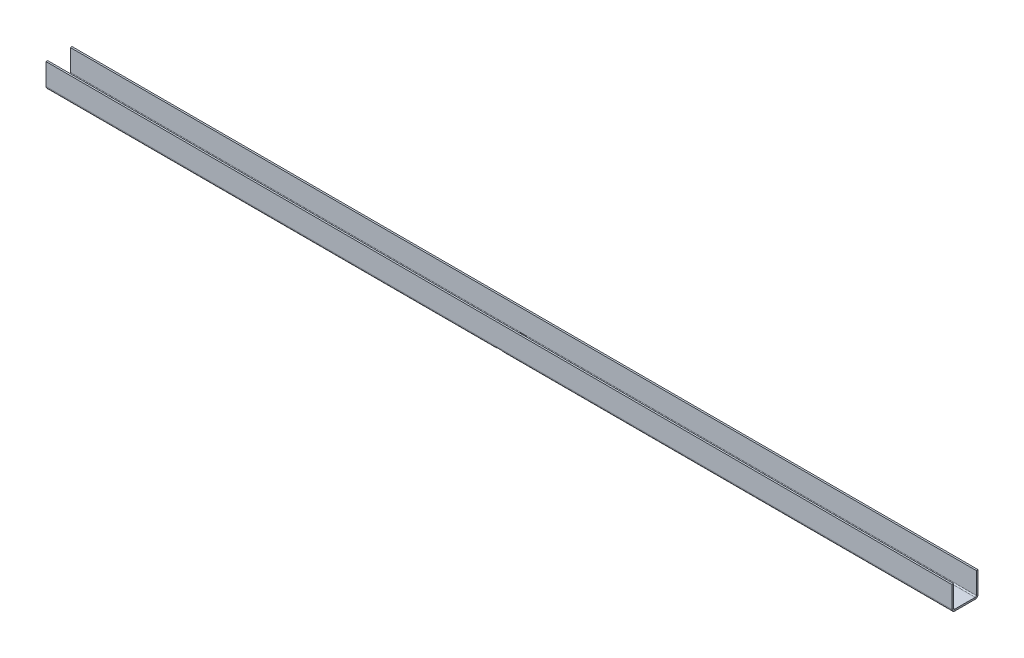
ISO-10303-21;
HEADER;
FILE_DESCRIPTION(('STEP AP214'),'2;1');
FILE_NAME('part.step','',(''),(''),'','','');
FILE_SCHEMA(('AUTOMOTIVE_DESIGN { 1 0 10303 214 1 1 1 1 }'));
ENDSEC;
DATA;
#1=APPLICATION_CONTEXT('core data for automotive mechanical design processes');
#2=APPLICATION_PROTOCOL_DEFINITION('international standard','automotive_design',2000,#1);
#3=PRODUCT_CONTEXT('',#1,'mechanical');
#4=PRODUCT('Part','Part','',(#3));
#5=PRODUCT_RELATED_PRODUCT_CATEGORY('part','',(#4));
#6=PRODUCT_DEFINITION_FORMATION('','',#4);
#7=PRODUCT_DEFINITION_CONTEXT('part definition',#1,'design');
#8=PRODUCT_DEFINITION('design','',#6,#7);
#9=PRODUCT_DEFINITION_SHAPE('','',#8);
#10=(LENGTH_UNIT() NAMED_UNIT(*) SI_UNIT(.MILLI.,.METRE.));
#11=(NAMED_UNIT(*) PLANE_ANGLE_UNIT() SI_UNIT($,.RADIAN.));
#12=(NAMED_UNIT(*) SI_UNIT($,.STERADIAN.) SOLID_ANGLE_UNIT());
#13=UNCERTAINTY_MEASURE_WITH_UNIT(LENGTH_MEASURE(1.E-05),#10,'distance_accuracy_value','');
#14=(GEOMETRIC_REPRESENTATION_CONTEXT(3) GLOBAL_UNCERTAINTY_ASSIGNED_CONTEXT((#13)) GLOBAL_UNIT_ASSIGNED_CONTEXT((#10,
#11,#12)) REPRESENTATION_CONTEXT('',''));
#15=CARTESIAN_POINT('',(0.,0.,0.));
#16=DIRECTION('',(0.,0.,1.));
#17=DIRECTION('',(1.,0.,0.));
#18=AXIS2_PLACEMENT_3D('',#15,#16,#17);
#19=CARTESIAN_POINT('',(400.000000000001,-1.5000000000005,-528.951186384639));
#20=DIRECTION('',(0.,1.,0.));
#21=DIRECTION('',(1.,0.,0.));
#22=AXIS2_PLACEMENT_3D('',#19,#20,#21);
#23=PLANE('',#22);
#24=DIRECTION('',(-1.,0.,0.));
#25=VECTOR('',#24,1.);
#26=CARTESIAN_POINT('',(400.,-1.5000000000005,1071.5));
#27=LINE('',#26,#25);
#28=CARTESIAN_POINT('',(-400.,-1.50000000000028,1071.5));
#29=VERTEX_POINT('',#28);
#30=CARTESIAN_POINT('',(400.,-1.5000000000005,1071.5));
#31=VERTEX_POINT('',#30);
#32=EDGE_CURVE('E302',#29,#31,#27,.F.);
#33=ORIENTED_EDGE('',*,*,#32,.T.);
#34=DIRECTION('',(0.,0.,1.));
#35=VECTOR('',#34,1.);
#36=CARTESIAN_POINT('',(400.000000000001,-1.5000000000005,-528.951186384639));
#37=LINE('',#36,#35);
#38=CARTESIAN_POINT('',(400.,-1.5000000000005,1070.));
#39=VERTEX_POINT('',#38);
#40=EDGE_CURVE('E316',#39,#31,#37,.T.);
#41=ORIENTED_EDGE('',*,*,#40,.F.);
#42=DIRECTION('',(1.,0.,0.));
#43=VECTOR('',#42,1.);
#44=CARTESIAN_POINT('',(400.,-1.5000000000005,1070.));
#45=LINE('',#44,#43);
#46=CARTESIAN_POINT('',(-400.,-1.50000000000028,1070.));
#47=VERTEX_POINT('',#46);
#48=EDGE_CURVE('E94',#39,#47,#45,.F.);
#49=ORIENTED_EDGE('',*,*,#48,.T.);
#50=DIRECTION('',(0.,0.,1.));
#51=VECTOR('',#50,1.);
#52=CARTESIAN_POINT('',(-399.999999999999,-1.50000000000028,-528.95118638464));
#53=LINE('',#52,#51);
#54=EDGE_CURVE('E307',#47,#29,#53,.T.);
#55=ORIENTED_EDGE('',*,*,#54,.T.);
#56=EDGE_LOOP('',(#33,#41,#49,#55));
#57=FACE_BOUND('',#56,.T.);
#58=ADVANCED_FACE('F69',(#57),#23,.T.);
#59=CARTESIAN_POINT('',(-399.999999999999,-23.0000000000004,-528.95118638464));
#60=DIRECTION('',(-1.,0.,0.));
#61=DIRECTION('',(0.,1.,0.));
#62=AXIS2_PLACEMENT_3D('',#59,#60,#61);
#63=PLANE('',#62);
#64=DIRECTION('',(0.,1.,0.));
#65=VECTOR('',#64,1.);
#66=CARTESIAN_POINT('',(-400.,-1.50000000000028,1071.5));
#67=LINE('',#66,#65);
#68=CARTESIAN_POINT('',(-400.,-20.5000000000002,1071.5));
#69=VERTEX_POINT('',#68);
#70=EDGE_CURVE('E294',#69,#29,#67,.T.);
#71=ORIENTED_EDGE('',*,*,#70,.T.);
#72=ORIENTED_EDGE('',*,*,#54,.F.);
#73=DIRECTION('',(0.,1.,0.));
#74=VECTOR('',#73,1.);
#75=CARTESIAN_POINT('',(-400.,-23.0000000000001,1070.));
#76=LINE('',#75,#74);
#77=CARTESIAN_POINT('',(-400.,-20.5000000000002,1070.));
#78=VERTEX_POINT('',#77);
#79=EDGE_CURVE('E306',#47,#78,#76,.F.);
#80=ORIENTED_EDGE('',*,*,#79,.T.);
#81=DIRECTION('',(0.,0.,1.));
#82=VECTOR('',#81,1.);
#83=CARTESIAN_POINT('',(-399.999999999999,-20.5000000000004,-528.95118638464));
#84=LINE('',#83,#82);
#85=EDGE_CURVE('E310',#78,#69,#84,.T.);
#86=ORIENTED_EDGE('',*,*,#85,.T.);
#87=EDGE_LOOP('',(#71,#72,#80,#86));
#88=FACE_BOUND('',#87,.T.);
#89=ADVANCED_FACE('F311',(#88),#63,.T.);
#90=CARTESIAN_POINT('',(400.,-1.5000000000005,1071.5));
#91=DIRECTION('',(0.,0.,-1.));
#92=DIRECTION('',(-1.,0.,0.));
#93=AXIS2_PLACEMENT_3D('',#90,#91,#92);
#94=PLANE('',#93);
#95=DIRECTION('',(-1.,0.,0.));
#96=VECTOR('',#95,1.);
#97=CARTESIAN_POINT('',(400.,-20.5000000000006,1071.5));
#98=LINE('',#97,#96);
#99=CARTESIAN_POINT('',(400.,-20.5000000000002,1071.5));
#100=VERTEX_POINT('',#99);
#101=EDGE_CURVE('E300',#100,#69,#98,.T.);
#102=ORIENTED_EDGE('',*,*,#101,.F.);
#103=DIRECTION('',(0.,1.,0.));
#104=VECTOR('',#103,1.);
#105=CARTESIAN_POINT('',(400.,-1.5000000000005,1071.5));
#106=LINE('',#105,#104);
#107=EDGE_CURVE('E689',#31,#100,#106,.F.);
#108=ORIENTED_EDGE('',*,*,#107,.F.);
#109=ORIENTED_EDGE('',*,*,#32,.F.);
#110=ORIENTED_EDGE('',*,*,#70,.F.);
#111=EDGE_LOOP('',(#102,#108,#109,#110));
#112=FACE_BOUND('',#111,.T.);
#113=ADVANCED_FACE('F297',(#112),#94,.F.);
#114=CARTESIAN_POINT('',(400.000000000001,-20.5000000000004,-528.951186384639));
#115=DIRECTION('',(-1.,0.,0.));
#116=DIRECTION('',(0.,1.,0.));
#117=AXIS2_PLACEMENT_3D('',#114,#115,#116);
#118=PLANE('',#117);
#119=ORIENTED_EDGE('',*,*,#40,.T.);
#120=ORIENTED_EDGE('',*,*,#107,.T.);
#121=DIRECTION('',(0.,0.,1.));
#122=VECTOR('',#121,1.);
#123=CARTESIAN_POINT('',(400.000000000001,-20.5000000000004,-528.951186384639));
#124=LINE('',#123,#122);
#125=CARTESIAN_POINT('',(400.,-20.5000000000002,1070.));
#126=VERTEX_POINT('',#125);
#127=EDGE_CURVE('E74',#126,#100,#124,.T.);
#128=ORIENTED_EDGE('',*,*,#127,.F.);
#129=DIRECTION('',(0.,1.,0.));
#130=VECTOR('',#129,1.);
#131=CARTESIAN_POINT('',(400.,-20.5000000000006,1070.));
#132=LINE('',#131,#130);
#133=EDGE_CURVE('E81',#39,#126,#132,.F.);
#134=ORIENTED_EDGE('',*,*,#133,.F.);
#135=EDGE_LOOP('',(#119,#120,#128,#134));
#136=FACE_BOUND('',#135,.T.);
#137=ADVANCED_FACE('F699',(#136),#118,.F.);
#138=CARTESIAN_POINT('',(400.,-1.5000000000005,1070.));
#139=DIRECTION('',(0.,0.,-1.));
#140=DIRECTION('',(-1.,0.,0.));
#141=AXIS2_PLACEMENT_3D('',#138,#139,#140);
#142=PLANE('',#141);
#143=ORIENTED_EDGE('',*,*,#133,.T.);
#144=DIRECTION('',(-1.,0.,0.));
#145=VECTOR('',#144,1.);
#146=CARTESIAN_POINT('',(400.,-20.5000000000006,1070.));
#147=LINE('',#146,#145);
#148=EDGE_CURVE('E13',#126,#78,#147,.T.);
#149=ORIENTED_EDGE('',*,*,#148,.T.);
#150=ORIENTED_EDGE('',*,*,#79,.F.);
#151=ORIENTED_EDGE('',*,*,#48,.F.);
#152=EDGE_LOOP('',(#143,#149,#150,#151));
#153=FACE_BOUND('',#152,.T.);
#154=ADVANCED_FACE('F72',(#153),#142,.T.);
#155=CARTESIAN_POINT('',(400.,-21.4999999999999,1070.));
#156=DIRECTION('',(0.,1.,0.));
#157=DIRECTION('',(0.,0.,1.));
#158=AXIS2_PLACEMENT_3D('',#155,#156,#157);
#159=PLANE('',#158);
#160=DIRECTION('',(-1.,0.,0.));
#161=VECTOR('',#160,1.);
#162=CARTESIAN_POINT('',(400.,-21.4999999999999,1051.));
#163=LINE('',#162,#161);
#164=CARTESIAN_POINT('',(400.,-21.4999999999999,1051.));
#165=VERTEX_POINT('',#164);
#166=CARTESIAN_POINT('',(2.69999999999998,-21.4999999999999,1051.));
#167=VERTEX_POINT('',#166);
#168=EDGE_CURVE('E472',#165,#167,#163,.T.);
#169=ORIENTED_EDGE('',*,*,#168,.T.);
#170=DIRECTION('',(0.,0.,1.));
#171=VECTOR('',#170,1.);
#172=CARTESIAN_POINT('',(2.69999999999998,-21.4999999999999,1070.));
#173=LINE('',#172,#171);
#174=CARTESIAN_POINT('',(2.7,-21.4999999999999,1053.5));
#175=VERTEX_POINT('',#174);
#176=EDGE_CURVE('E469',#167,#175,#173,.T.);
#177=ORIENTED_EDGE('',*,*,#176,.T.);
#178=DIRECTION('',(-1.,0.,0.));
#179=VECTOR('',#178,1.);
#180=CARTESIAN_POINT('',(400.,-21.4999999999999,1053.5));
#181=LINE('',#180,#179);
#182=CARTESIAN_POINT('',(-2.7,-21.4999999999999,1053.5));
#183=VERTEX_POINT('',#182);
#184=EDGE_CURVE('E465',#175,#183,#181,.T.);
#185=ORIENTED_EDGE('',*,*,#184,.T.);
#186=DIRECTION('',(0.,0.,-1.));
#187=VECTOR('',#186,1.);
#188=CARTESIAN_POINT('',(-2.69999999999998,-21.4999999999999,1070.));
#189=LINE('',#188,#187);
#190=CARTESIAN_POINT('',(-2.69999999999998,-21.4999999999999,1051.));
#191=VERTEX_POINT('',#190);
#192=EDGE_CURVE('E461',#183,#191,#189,.T.);
#193=ORIENTED_EDGE('',*,*,#192,.T.);
#194=CARTESIAN_POINT('',(-400.,-21.4999999999999,1051.));
#195=VERTEX_POINT('',#194);
#196=EDGE_CURVE('E464',#191,#195,#163,.T.);
#197=ORIENTED_EDGE('',*,*,#196,.T.);
#198=DIRECTION('',(0.,0.,1.));
#199=VECTOR('',#198,1.);
#200=CARTESIAN_POINT('',(-400.,-21.4999999999999,1048.5));
#201=LINE('',#200,#199);
#202=CARTESIAN_POINT('',(-400.,-21.5000000000002,1069.));
#203=VERTEX_POINT('',#202);
#204=EDGE_CURVE('E447',#203,#195,#201,.F.);
#205=ORIENTED_EDGE('',*,*,#204,.F.);
#206=DIRECTION('',(1.,0.,0.));
#207=VECTOR('',#206,1.);
#208=CARTESIAN_POINT('',(400.,-21.4999999999999,1069.));
#209=LINE('',#208,#207);
#210=CARTESIAN_POINT('',(-2.70000000000004,-21.4999999999999,1069.));
#211=VERTEX_POINT('',#210);
#212=EDGE_CURVE('E440',#203,#211,#209,.T.);
#213=ORIENTED_EDGE('',*,*,#212,.T.);
#214=DIRECTION('',(0.,0.,-1.));
#215=VECTOR('',#214,1.);
#216=CARTESIAN_POINT('',(-2.70000000000004,-21.4999999999999,1070.));
#217=LINE('',#216,#215);
#218=CARTESIAN_POINT('',(-2.70000000000001,-21.4999999999999,1066.5));
#219=VERTEX_POINT('',#218);
#220=EDGE_CURVE('E446',#211,#219,#217,.T.);
#221=ORIENTED_EDGE('',*,*,#220,.T.);
#222=DIRECTION('',(1.,0.,0.));
#223=VECTOR('',#222,1.);
#224=CARTESIAN_POINT('',(400.,-21.4999999999999,1066.5));
#225=LINE('',#224,#223);
#226=CARTESIAN_POINT('',(2.69999999999999,-21.4999999999999,1066.5));
#227=VERTEX_POINT('',#226);
#228=EDGE_CURVE('E454',#219,#227,#225,.T.);
#229=ORIENTED_EDGE('',*,*,#228,.T.);
#230=DIRECTION('',(0.,0.,1.));
#231=VECTOR('',#230,1.);
#232=CARTESIAN_POINT('',(2.69999999999998,-21.4999999999999,1070.));
#233=LINE('',#232,#231);
#234=CARTESIAN_POINT('',(2.69999999999992,-21.5000000000002,1069.));
#235=VERTEX_POINT('',#234);
#236=EDGE_CURVE('E1221',#227,#235,#233,.T.);
#237=ORIENTED_EDGE('',*,*,#236,.T.);
#238=CARTESIAN_POINT('',(400.,-21.5000000000002,1069.));
#239=VERTEX_POINT('',#238);
#240=EDGE_CURVE('E448',#235,#239,#209,.T.);
#241=ORIENTED_EDGE('',*,*,#240,.T.);
#242=DIRECTION('',(0.,0.,-1.));
#243=VECTOR('',#242,1.);
#244=CARTESIAN_POINT('',(400.,-21.4999999999999,1071.5));
#245=LINE('',#244,#243);
#246=EDGE_CURVE('E1220',#165,#239,#245,.F.);
#247=ORIENTED_EDGE('',*,*,#246,.F.);
#248=EDGE_LOOP('',(#169,#177,#185,#193,#197,#205,#213,#221,#229,#237,#241,#247));
#249=FACE_BOUND('',#248,.T.);
#250=ADVANCED_FACE('F718',(#249),#159,.T.);
#251=CARTESIAN_POINT('',(2.69999999999998,1577.40494875516,1070.));
#252=DIRECTION('',(1.,0.,0.));
#253=DIRECTION('',(0.,-1.,0.));
#254=AXIS2_PLACEMENT_3D('',#251,#252,#253);
#255=PLANE('',#254);
#256=DIRECTION('',(0.,-1.,0.));
#257=VECTOR('',#256,1.);
#258=CARTESIAN_POINT('',(2.69999999999998,1577.40494875516,1051.));
#259=LINE('',#258,#257);
#260=CARTESIAN_POINT('',(2.69999999999992,-22.9999999999999,1051.));
#261=VERTEX_POINT('',#260);
#262=EDGE_CURVE('E683',#167,#261,#259,.T.);
#263=ORIENTED_EDGE('',*,*,#262,.T.);
#264=DIRECTION('',(0.,0.,1.));
#265=VECTOR('',#264,1.);
#266=CARTESIAN_POINT('',(2.69999999999998,-22.9999999999999,1070.));
#267=LINE('',#266,#265);
#268=CARTESIAN_POINT('',(2.7,-22.9999999999999,1053.5));
#269=VERTEX_POINT('',#268);
#270=EDGE_CURVE('E128',#261,#269,#267,.T.);
#271=ORIENTED_EDGE('',*,*,#270,.T.);
#272=DIRECTION('',(0.,-1.,0.));
#273=VECTOR('',#272,1.);
#274=CARTESIAN_POINT('',(2.7,1577.40494875516,1053.5));
#275=LINE('',#274,#273);
#276=EDGE_CURVE('E680',#175,#269,#275,.T.);
#277=ORIENTED_EDGE('',*,*,#276,.F.);
#278=ORIENTED_EDGE('',*,*,#176,.F.);
#279=EDGE_LOOP('',(#263,#271,#277,#278));
#280=FACE_BOUND('',#279,.T.);
#281=ADVANCED_FACE('F708',(#280),#255,.F.);
#282=CARTESIAN_POINT('',(400.,1577.40494875516,1053.5));
#283=DIRECTION('',(0.,0.,1.));
#284=DIRECTION('',(0.,-1.,0.));
#285=AXIS2_PLACEMENT_3D('',#282,#283,#284);
#286=PLANE('',#285);
#287=ORIENTED_EDGE('',*,*,#276,.T.);
#288=DIRECTION('',(-1.,0.,0.));
#289=VECTOR('',#288,1.);
#290=CARTESIAN_POINT('',(400.,-22.9999999999999,1053.5));
#291=LINE('',#290,#289);
#292=CARTESIAN_POINT('',(-2.7,-22.9999999999999,1053.5));
#293=VERTEX_POINT('',#292);
#294=EDGE_CURVE('E136',#269,#293,#291,.T.);
#295=ORIENTED_EDGE('',*,*,#294,.T.);
#296=DIRECTION('',(0.,-1.,0.));
#297=VECTOR('',#296,1.);
#298=CARTESIAN_POINT('',(-2.7,1577.40494875516,1053.5));
#299=LINE('',#298,#297);
#300=EDGE_CURVE('E677',#183,#293,#299,.T.);
#301=ORIENTED_EDGE('',*,*,#300,.F.);
#302=ORIENTED_EDGE('',*,*,#184,.F.);
#303=EDGE_LOOP('',(#287,#295,#301,#302));
#304=FACE_BOUND('',#303,.T.);
#305=ADVANCED_FACE('F727',(#304),#286,.F.);
#306=CARTESIAN_POINT('',(-2.69999999999998,1577.40494875516,1070.));
#307=DIRECTION('',(-1.,0.,0.));
#308=DIRECTION('',(0.,1.,0.));
#309=AXIS2_PLACEMENT_3D('',#306,#307,#308);
#310=PLANE('',#309);
#311=ORIENTED_EDGE('',*,*,#300,.T.);
#312=DIRECTION('',(0.,0.,-1.));
#313=VECTOR('',#312,1.);
#314=CARTESIAN_POINT('',(-2.69999999999998,-22.9999999999999,1070.));
#315=LINE('',#314,#313);
#316=CARTESIAN_POINT('',(-2.69999999999998,-22.9999999999999,1051.));
#317=VERTEX_POINT('',#316);
#318=EDGE_CURVE('E481',#293,#317,#315,.T.);
#319=ORIENTED_EDGE('',*,*,#318,.T.);
#320=DIRECTION('',(0.,-1.,0.));
#321=VECTOR('',#320,1.);
#322=CARTESIAN_POINT('',(-2.69999999999998,1577.40494875516,1051.));
#323=LINE('',#322,#321);
#324=EDGE_CURVE('E674',#191,#317,#323,.T.);
#325=ORIENTED_EDGE('',*,*,#324,.F.);
#326=ORIENTED_EDGE('',*,*,#192,.F.);
#327=EDGE_LOOP('',(#311,#319,#325,#326));
#328=FACE_BOUND('',#327,.T.);
#329=ADVANCED_FACE('F746',(#328),#310,.F.);
#330=CARTESIAN_POINT('',(-400.,1577.40494875516,1048.5));
#331=DIRECTION('',(-1.,0.,0.));
#332=DIRECTION('',(0.,1.,0.));
#333=AXIS2_PLACEMENT_3D('',#330,#331,#332);
#334=PLANE('',#333);
#335=DIRECTION('',(0.,0.,1.));
#336=VECTOR('',#335,1.);
#337=CARTESIAN_POINT('',(-400.,-22.9999999999999,1070.));
#338=LINE('',#337,#336);
#339=CARTESIAN_POINT('',(-400.,-22.9999999999999,1051.));
#340=VERTEX_POINT('',#339);
#341=CARTESIAN_POINT('',(-400.,-23.0000000000002,1069.));
#342=VERTEX_POINT('',#341);
#343=EDGE_CURVE('E486',#340,#342,#338,.T.);
#344=ORIENTED_EDGE('',*,*,#343,.T.);
#345=DIRECTION('',(0.,-1.,0.));
#346=VECTOR('',#345,1.);
#347=CARTESIAN_POINT('',(-400.,1577.40494875516,1069.));
#348=LINE('',#347,#346);
#349=EDGE_CURVE('E330',#203,#342,#348,.T.);
#350=ORIENTED_EDGE('',*,*,#349,.F.);
#351=ORIENTED_EDGE('',*,*,#204,.T.);
#352=DIRECTION('',(0.,-1.,0.));
#353=VECTOR('',#352,1.);
#354=CARTESIAN_POINT('',(-400.,1577.40494875516,1051.));
#355=LINE('',#354,#353);
#356=EDGE_CURVE('E667',#195,#340,#355,.T.);
#357=ORIENTED_EDGE('',*,*,#356,.T.);
#358=EDGE_LOOP('',(#344,#350,#351,#357));
#359=FACE_BOUND('',#358,.T.);
#360=ADVANCED_FACE('F743',(#359),#334,.T.);
#361=CARTESIAN_POINT('',(-2.70000000000004,1577.40494875516,1070.));
#362=DIRECTION('',(-1.,0.,0.));
#363=DIRECTION('',(0.,1.,0.));
#364=AXIS2_PLACEMENT_3D('',#361,#362,#363);
#365=PLANE('',#364);
#366=DIRECTION('',(0.,-1.,0.));
#367=VECTOR('',#366,1.);
#368=CARTESIAN_POINT('',(-2.70000000000004,1577.40494875516,1069.));
#369=LINE('',#368,#367);
#370=CARTESIAN_POINT('',(-2.70000000000015,-23.0000000000002,1069.));
#371=VERTEX_POINT('',#370);
#372=EDGE_CURVE('E659',#211,#371,#369,.T.);
#373=ORIENTED_EDGE('',*,*,#372,.T.);
#374=DIRECTION('',(0.,0.,-1.));
#375=VECTOR('',#374,1.);
#376=CARTESIAN_POINT('',(-2.70000000000004,-22.9999999999999,1070.));
#377=LINE('',#376,#375);
#378=CARTESIAN_POINT('',(-2.70000000000001,-22.9999999999999,1066.5));
#379=VERTEX_POINT('',#378);
#380=EDGE_CURVE('E490',#371,#379,#377,.T.);
#381=ORIENTED_EDGE('',*,*,#380,.T.);
#382=DIRECTION('',(0.,-1.,0.));
#383=VECTOR('',#382,1.);
#384=CARTESIAN_POINT('',(-2.70000000000001,1577.40494875516,1066.5));
#385=LINE('',#384,#383);
#386=EDGE_CURVE('E663',#219,#379,#385,.T.);
#387=ORIENTED_EDGE('',*,*,#386,.F.);
#388=ORIENTED_EDGE('',*,*,#220,.F.);
#389=EDGE_LOOP('',(#373,#381,#387,#388));
#390=FACE_BOUND('',#389,.T.);
#391=ADVANCED_FACE('F660',(#390),#365,.F.);
#392=CARTESIAN_POINT('',(400.,1577.40494875516,1066.5));
#393=DIRECTION('',(0.,0.,-1.));
#394=DIRECTION('',(0.,1.,0.));
#395=AXIS2_PLACEMENT_3D('',#392,#393,#394);
#396=PLANE('',#395);
#397=ORIENTED_EDGE('',*,*,#386,.T.);
#398=DIRECTION('',(1.,0.,0.));
#399=VECTOR('',#398,1.);
#400=CARTESIAN_POINT('',(400.,-22.9999999999999,1066.5));
#401=LINE('',#400,#399);
#402=CARTESIAN_POINT('',(2.69999999999999,-22.9999999999999,1066.5));
#403=VERTEX_POINT('',#402);
#404=EDGE_CURVE('E496',#379,#403,#401,.T.);
#405=ORIENTED_EDGE('',*,*,#404,.T.);
#406=DIRECTION('',(0.,-1.,0.));
#407=VECTOR('',#406,1.);
#408=CARTESIAN_POINT('',(2.69999999999999,1577.40494875516,1066.5));
#409=LINE('',#408,#407);
#410=EDGE_CURVE('E514',#227,#403,#409,.T.);
#411=ORIENTED_EDGE('',*,*,#410,.F.);
#412=ORIENTED_EDGE('',*,*,#228,.F.);
#413=EDGE_LOOP('',(#397,#405,#411,#412));
#414=FACE_BOUND('',#413,.T.);
#415=ADVANCED_FACE('F738',(#414),#396,.F.);
#416=CARTESIAN_POINT('',(2.69999999999998,1577.40494875516,1070.));
#417=DIRECTION('',(1.,0.,0.));
#418=DIRECTION('',(0.,-1.,0.));
#419=AXIS2_PLACEMENT_3D('',#416,#417,#418);
#420=PLANE('',#419);
#421=ORIENTED_EDGE('',*,*,#410,.T.);
#422=DIRECTION('',(0.,0.,1.));
#423=VECTOR('',#422,1.);
#424=CARTESIAN_POINT('',(2.69999999999998,-22.9999999999999,1070.));
#425=LINE('',#424,#423);
#426=CARTESIAN_POINT('',(2.69999999999992,-23.0000000000002,1069.));
#427=VERTEX_POINT('',#426);
#428=EDGE_CURVE('E354',#403,#427,#425,.T.);
#429=ORIENTED_EDGE('',*,*,#428,.T.);
#430=DIRECTION('',(0.,-1.,0.));
#431=VECTOR('',#430,1.);
#432=CARTESIAN_POINT('',(2.69999999999998,1577.40494875516,1069.));
#433=LINE('',#432,#431);
#434=EDGE_CURVE('E513',#235,#427,#433,.T.);
#435=ORIENTED_EDGE('',*,*,#434,.F.);
#436=ORIENTED_EDGE('',*,*,#236,.F.);
#437=EDGE_LOOP('',(#421,#429,#435,#436));
#438=FACE_BOUND('',#437,.T.);
#439=ADVANCED_FACE('F511',(#438),#420,.F.);
#440=CARTESIAN_POINT('',(400.,1577.40494875516,1071.5));
#441=DIRECTION('',(1.,0.,0.));
#442=DIRECTION('',(0.,-1.,0.));
#443=AXIS2_PLACEMENT_3D('',#440,#441,#442);
#444=PLANE('',#443);
#445=DIRECTION('',(0.,0.,1.));
#446=VECTOR('',#445,1.);
#447=CARTESIAN_POINT('',(400.,-22.9999999999999,1070.));
#448=LINE('',#447,#446);
#449=CARTESIAN_POINT('',(400.,-22.9999999999999,1069.));
#450=VERTEX_POINT('',#449);
#451=CARTESIAN_POINT('',(400.,-22.9999999999999,1051.));
#452=VERTEX_POINT('',#451);
#453=EDGE_CURVE('E355',#450,#452,#448,.F.);
#454=ORIENTED_EDGE('',*,*,#453,.T.);
#455=DIRECTION('',(0.,-1.,0.));
#456=VECTOR('',#455,1.);
#457=CARTESIAN_POINT('',(400.,1577.40494875516,1051.));
#458=LINE('',#457,#456);
#459=EDGE_CURVE('E765',#165,#452,#458,.T.);
#460=ORIENTED_EDGE('',*,*,#459,.F.);
#461=ORIENTED_EDGE('',*,*,#246,.T.);
#462=DIRECTION('',(0.,-1.,0.));
#463=VECTOR('',#462,1.);
#464=CARTESIAN_POINT('',(400.,1577.40494875516,1069.));
#465=LINE('',#464,#463);
#466=EDGE_CURVE('E766',#239,#450,#465,.T.);
#467=ORIENTED_EDGE('',*,*,#466,.T.);
#468=EDGE_LOOP('',(#454,#460,#461,#467));
#469=FACE_BOUND('',#468,.T.);
#470=ADVANCED_FACE('F732',(#469),#444,.T.);
#471=CARTESIAN_POINT('',(400.,-22.9999999999999,1070.));
#472=DIRECTION('',(0.,1.,0.));
#473=DIRECTION('',(0.,0.,1.));
#474=AXIS2_PLACEMENT_3D('',#471,#472,#473);
#475=PLANE('',#474);
#476=ORIENTED_EDGE('',*,*,#270,.F.);
#477=DIRECTION('',(-1.,0.,0.));
#478=VECTOR('',#477,1.);
#479=CARTESIAN_POINT('',(400.,-22.9999999999999,1051.));
#480=LINE('',#479,#478);
#481=EDGE_CURVE('E567',#452,#261,#480,.T.);
#482=ORIENTED_EDGE('',*,*,#481,.F.);
#483=ORIENTED_EDGE('',*,*,#453,.F.);
#484=DIRECTION('',(1.,0.,0.));
#485=VECTOR('',#484,1.);
#486=CARTESIAN_POINT('',(400.,-22.9999999999999,1069.));
#487=LINE('',#486,#485);
#488=EDGE_CURVE('E349',#427,#450,#487,.T.);
#489=ORIENTED_EDGE('',*,*,#488,.F.);
#490=ORIENTED_EDGE('',*,*,#428,.F.);
#491=ORIENTED_EDGE('',*,*,#404,.F.);
#492=ORIENTED_EDGE('',*,*,#380,.F.);
#493=EDGE_CURVE('E356',#342,#371,#487,.T.);
#494=ORIENTED_EDGE('',*,*,#493,.F.);
#495=ORIENTED_EDGE('',*,*,#343,.F.);
#496=EDGE_CURVE('E485',#317,#340,#480,.T.);
#497=ORIENTED_EDGE('',*,*,#496,.F.);
#498=ORIENTED_EDGE('',*,*,#318,.F.);
#499=ORIENTED_EDGE('',*,*,#294,.F.);
#500=EDGE_LOOP('',(#476,#482,#483,#489,#490,#491,#492,#494,#495,#497,#498,#499));
#501=FACE_BOUND('',#500,.T.);
#502=ADVANCED_FACE('F517',(#501),#475,.F.);
#503=CARTESIAN_POINT('',(400.,-1.49999999999993,2648.95118638464));
#504=DIRECTION('',(0.,1.,0.));
#505=DIRECTION('',(0.,0.,1.));
#506=AXIS2_PLACEMENT_3D('',#503,#504,#505);
#507=PLANE('',#506);
#508=DIRECTION('',(1.,0.,0.));
#509=VECTOR('',#508,1.);
#510=CARTESIAN_POINT('',(400.,-1.49999999999993,1048.5));
#511=LINE('',#510,#509);
#512=CARTESIAN_POINT('',(400.,-1.49999999999993,1048.5));
#513=VERTEX_POINT('',#512);
#514=CARTESIAN_POINT('',(-400.,-1.49999999999993,1048.5));
#515=VERTEX_POINT('',#514);
#516=EDGE_CURVE('E398',#513,#515,#511,.F.);
#517=ORIENTED_EDGE('',*,*,#516,.T.);
#518=DIRECTION('',(0.,0.,-1.));
#519=VECTOR('',#518,1.);
#520=CARTESIAN_POINT('',(-400.,-1.49999999999993,2648.95118638464));
#521=LINE('',#520,#519);
#522=CARTESIAN_POINT('',(-400.,-1.49999999999993,1050.));
#523=VERTEX_POINT('',#522);
#524=EDGE_CURVE('E581',#523,#515,#521,.T.);
#525=ORIENTED_EDGE('',*,*,#524,.F.);
#526=DIRECTION('',(1.,0.,0.));
#527=VECTOR('',#526,1.);
#528=CARTESIAN_POINT('',(400.,-1.49999999999993,1050.));
#529=LINE('',#528,#527);
#530=CARTESIAN_POINT('',(400.,-1.49999999999993,1050.));
#531=VERTEX_POINT('',#530);
#532=EDGE_CURVE('E394',#523,#531,#529,.T.);
#533=ORIENTED_EDGE('',*,*,#532,.T.);
#534=DIRECTION('',(0.,0.,-1.));
#535=VECTOR('',#534,1.);
#536=CARTESIAN_POINT('',(400.,-1.49999999999993,2648.95118638464));
#537=LINE('',#536,#535);
#538=EDGE_CURVE('E390',#531,#513,#537,.T.);
#539=ORIENTED_EDGE('',*,*,#538,.T.);
#540=EDGE_LOOP('',(#517,#525,#533,#539));
#541=FACE_BOUND('',#540,.T.);
#542=ADVANCED_FACE('F805',(#541),#507,.T.);
#543=CARTESIAN_POINT('',(400.,-22.9999999999999,2648.95118638464));
#544=DIRECTION('',(1.,0.,0.));
#545=DIRECTION('',(0.,0.,-1.));
#546=AXIS2_PLACEMENT_3D('',#543,#544,#545);
#547=PLANE('',#546);
#548=DIRECTION('',(0.,1.,0.));
#549=VECTOR('',#548,1.);
#550=CARTESIAN_POINT('',(400.,-21.4999999999999,1048.5));
#551=LINE('',#550,#549);
#552=CARTESIAN_POINT('',(400.,-20.4999999999999,1048.5));
#553=VERTEX_POINT('',#552);
#554=EDGE_CURVE('E383',#553,#513,#551,.T.);
#555=ORIENTED_EDGE('',*,*,#554,.T.);
#556=ORIENTED_EDGE('',*,*,#538,.F.);
#557=DIRECTION('',(0.,1.,0.));
#558=VECTOR('',#557,1.);
#559=CARTESIAN_POINT('',(400.,-22.9999999999999,1050.));
#560=LINE('',#559,#558);
#561=CARTESIAN_POINT('',(400.,-20.4999999999999,1050.));
#562=VERTEX_POINT('',#561);
#563=EDGE_CURVE('E389',#531,#562,#560,.F.);
#564=ORIENTED_EDGE('',*,*,#563,.T.);
#565=DIRECTION('',(0.,0.,-1.));
#566=VECTOR('',#565,1.);
#567=CARTESIAN_POINT('',(400.,-20.4999999999999,2648.95118638464));
#568=LINE('',#567,#566);
#569=EDGE_CURVE('E585',#562,#553,#568,.T.);
#570=ORIENTED_EDGE('',*,*,#569,.T.);
#571=EDGE_LOOP('',(#555,#556,#564,#570));
#572=FACE_BOUND('',#571,.T.);
#573=ADVANCED_FACE('F595',(#572),#547,.T.);
#574=CARTESIAN_POINT('',(400.,-21.4999999999999,1048.5));
#575=DIRECTION('',(0.,0.,1.));
#576=DIRECTION('',(1.,0.,0.));
#577=AXIS2_PLACEMENT_3D('',#574,#575,#576);
#578=PLANE('',#577);
#579=ORIENTED_EDGE('',*,*,#516,.F.);
#580=ORIENTED_EDGE('',*,*,#554,.F.);
#581=DIRECTION('',(1.,0.,0.));
#582=VECTOR('',#581,1.);
#583=CARTESIAN_POINT('',(400.,-20.4999999999999,1048.5));
#584=LINE('',#583,#582);
#585=CARTESIAN_POINT('',(-400.,-20.4999999999999,1048.5));
#586=VERTEX_POINT('',#585);
#587=EDGE_CURVE('E402',#586,#553,#584,.T.);
#588=ORIENTED_EDGE('',*,*,#587,.F.);
#589=DIRECTION('',(0.,1.,0.));
#590=VECTOR('',#589,1.);
#591=CARTESIAN_POINT('',(-400.,-21.4999999999999,1048.5));
#592=LINE('',#591,#590);
#593=EDGE_CURVE('E582',#515,#586,#592,.F.);
#594=ORIENTED_EDGE('',*,*,#593,.F.);
#595=EDGE_LOOP('',(#579,#580,#588,#594));
#596=FACE_BOUND('',#595,.T.);
#597=ADVANCED_FACE('F811',(#596),#578,.F.);
#598=CARTESIAN_POINT('',(-400.,-20.4999999999999,2648.95118638464));
#599=DIRECTION('',(-1.,0.,0.));
#600=DIRECTION('',(0.,0.,1.));
#601=AXIS2_PLACEMENT_3D('',#598,#599,#600);
#602=PLANE('',#601);
#603=ORIENTED_EDGE('',*,*,#593,.T.);
#604=DIRECTION('',(0.,0.,-1.));
#605=VECTOR('',#604,1.);
#606=CARTESIAN_POINT('',(-400.,-20.4999999999999,2648.95118638464));
#607=LINE('',#606,#605);
#608=CARTESIAN_POINT('',(-400.,-20.4999999999999,1050.));
#609=VERTEX_POINT('',#608);
#610=EDGE_CURVE('E407',#609,#586,#607,.T.);
#611=ORIENTED_EDGE('',*,*,#610,.F.);
#612=DIRECTION('',(0.,1.,0.));
#613=VECTOR('',#612,1.);
#614=CARTESIAN_POINT('',(-400.,-20.4999999999999,1050.));
#615=LINE('',#614,#613);
#616=EDGE_CURVE('E576',#609,#523,#615,.T.);
#617=ORIENTED_EDGE('',*,*,#616,.T.);
#618=ORIENTED_EDGE('',*,*,#524,.T.);
#619=EDGE_LOOP('',(#603,#611,#617,#618));
#620=FACE_BOUND('',#619,.T.);
#621=ADVANCED_FACE('F816',(#620),#602,.T.);
#622=CARTESIAN_POINT('',(400.,-21.4999999999999,1050.));
#623=DIRECTION('',(0.,0.,1.));
#624=DIRECTION('',(1.,0.,0.));
#625=AXIS2_PLACEMENT_3D('',#622,#623,#624);
#626=PLANE('',#625);
#627=ORIENTED_EDGE('',*,*,#563,.F.);
#628=ORIENTED_EDGE('',*,*,#532,.F.);
#629=ORIENTED_EDGE('',*,*,#616,.F.);
#630=DIRECTION('',(1.,0.,0.));
#631=VECTOR('',#630,1.);
#632=CARTESIAN_POINT('',(400.,-20.4999999999999,1050.));
#633=LINE('',#632,#631);
#634=EDGE_CURVE('E574',#609,#562,#633,.T.);
#635=ORIENTED_EDGE('',*,*,#634,.T.);
#636=EDGE_LOOP('',(#627,#628,#629,#635));
#637=FACE_BOUND('',#636,.T.);
#638=ADVANCED_FACE('F600',(#637),#626,.T.);
#639=CARTESIAN_POINT('',(2.69999999999992,-20.5,1051.));
#640=DIRECTION('',(-1.,0.,0.));
#641=DIRECTION('',(0.,0.,1.));
#642=AXIS2_PLACEMENT_3D('',#639,#640,#641);
#643=PLANE('',#642);
#644=ORIENTED_EDGE('',*,*,#262,.F.);
#645=CARTESIAN_POINT('',(2.69999999999992,-20.5,1051.));
#646=DIRECTION('',(1.,0.,0.));
#647=DIRECTION('',(0.,0.,-1.));
#648=AXIS2_PLACEMENT_3D('',#645,#646,#647);
#649=CIRCLE('',#648,0.999999999999866);
#650=CARTESIAN_POINT('',(2.69999999999992,-20.8199999999999,1050.05258245741));
#651=VERTEX_POINT('',#650);
#652=EDGE_CURVE('E547',#167,#651,#649,.T.);
#653=ORIENTED_EDGE('',*,*,#652,.T.);
#654=DIRECTION('',(0.,-0.319999999999948,-0.947417542586178));
#655=VECTOR('',#654,1.);
#656=CARTESIAN_POINT('',(2.69999999999998,-20.9685521524625,1049.61276709731));
#657=LINE('',#656,#655);
#658=CARTESIAN_POINT('',(2.69999999999992,-21.2999999999998,1048.63145614353));
#659=VERTEX_POINT('',#658);
#660=EDGE_CURVE('E634',#651,#659,#657,.T.);
#661=ORIENTED_EDGE('',*,*,#660,.T.);
#662=CARTESIAN_POINT('',(2.69999999999992,-20.5,1051.));
#663=DIRECTION('',(1.,0.,0.));
#664=DIRECTION('',(0.,0.,-1.));
#665=AXIS2_PLACEMENT_3D('',#662,#663,#664);
#666=CIRCLE('',#665,2.49999999999992);
#667=EDGE_CURVE('E560',#261,#659,#666,.T.);
#668=ORIENTED_EDGE('',*,*,#667,.F.);
#669=EDGE_LOOP('',(#644,#653,#661,#668));
#670=FACE_BOUND('',#669,.T.);
#671=ADVANCED_FACE('F761',(#670),#643,.T.);
#672=CARTESIAN_POINT('',(0.,-20.9685521524625,1049.61276709731));
#673=DIRECTION('',(0.,-0.947417542586178,0.319999999999948));
#674=DIRECTION('',(-1.,0.,0.));
#675=AXIS2_PLACEMENT_3D('',#672,#673,#674);
#676=PLANE('',#675);
#677=ORIENTED_EDGE('',*,*,#660,.F.);
#678=DIRECTION('',(1.,0.,0.));
#679=VECTOR('',#678,1.);
#680=CARTESIAN_POINT('',(-1000.943344108,-20.8199999999999,1050.05258245741));
#681=LINE('',#680,#679);
#682=CARTESIAN_POINT('',(-2.70000000000004,-20.8199999999999,1050.05258245741));
#683=VERTEX_POINT('',#682);
#684=EDGE_CURVE('E622',#651,#683,#681,.F.);
#685=ORIENTED_EDGE('',*,*,#684,.T.);
#686=DIRECTION('',(0.,-0.319999999999912,-0.947417542586191));
#687=VECTOR('',#686,1.);
#688=CARTESIAN_POINT('',(-2.70000000000002,-20.9685521524624,1049.61276709731));
#689=LINE('',#688,#687);
#690=CARTESIAN_POINT('',(-2.70000000000004,-21.2999999999997,1048.63145614353));
#691=VERTEX_POINT('',#690);
#692=EDGE_CURVE('E565',#683,#691,#689,.T.);
#693=ORIENTED_EDGE('',*,*,#692,.T.);
#694=DIRECTION('',(1.,0.,0.));
#695=VECTOR('',#694,1.);
#696=CARTESIAN_POINT('',(-1000.943344108,-21.2999999999998,1048.63145614353));
#697=LINE('',#696,#695);
#698=EDGE_CURVE('E556',#659,#691,#697,.F.);
#699=ORIENTED_EDGE('',*,*,#698,.F.);
#700=EDGE_LOOP('',(#677,#685,#693,#699));
#701=FACE_BOUND('',#700,.T.);
#702=ADVANCED_FACE('F790',(#701),#676,.T.);
#703=CARTESIAN_POINT('',(-2.70000000000004,-20.5,1051.));
#704=DIRECTION('',(1.,0.,0.));
#705=DIRECTION('',(0.,1.,0.));
#706=AXIS2_PLACEMENT_3D('',#703,#704,#705);
#707=PLANE('',#706);
#708=ORIENTED_EDGE('',*,*,#692,.F.);
#709=CARTESIAN_POINT('',(-2.70000000000004,-20.5,1051.));
#710=DIRECTION('',(1.,0.,0.));
#711=DIRECTION('',(0.,0.,-1.));
#712=AXIS2_PLACEMENT_3D('',#709,#710,#711);
#713=CIRCLE('',#712,0.999999999999866);
#714=EDGE_CURVE('E616',#683,#191,#713,.F.);
#715=ORIENTED_EDGE('',*,*,#714,.T.);
#716=ORIENTED_EDGE('',*,*,#324,.T.);
#717=CARTESIAN_POINT('',(-2.70000000000004,-20.5,1051.));
#718=DIRECTION('',(1.,0.,0.));
#719=DIRECTION('',(0.,0.,-1.));
#720=AXIS2_PLACEMENT_3D('',#717,#718,#719);
#721=CIRCLE('',#720,2.49999999999992);
#722=EDGE_CURVE('E552',#691,#317,#721,.F.);
#723=ORIENTED_EDGE('',*,*,#722,.F.);
#724=EDGE_LOOP('',(#708,#715,#716,#723));
#725=FACE_BOUND('',#724,.T.);
#726=ADVANCED_FACE('F788',(#725),#707,.T.);
#727=CARTESIAN_POINT('',(-400.,-20.5,1051.));
#728=DIRECTION('',(-1.,0.,0.));
#729=DIRECTION('',(0.,0.,1.));
#730=AXIS2_PLACEMENT_3D('',#727,#728,#729);
#731=PLANE('',#730);
#732=ORIENTED_EDGE('',*,*,#356,.F.);
#733=CARTESIAN_POINT('',(-400.,-20.5,1051.));
#734=DIRECTION('',(1.,0.,0.));
#735=DIRECTION('',(0.,0.,-1.));
#736=AXIS2_PLACEMENT_3D('',#733,#734,#735);
#737=CIRCLE('',#736,0.999999999999866);
#738=EDGE_CURVE('E614',#195,#609,#737,.T.);
#739=ORIENTED_EDGE('',*,*,#738,.T.);
#740=ORIENTED_EDGE('',*,*,#610,.T.);
#741=CARTESIAN_POINT('',(-400.,-20.5,1051.));
#742=DIRECTION('',(1.,0.,0.));
#743=DIRECTION('',(0.,0.,-1.));
#744=AXIS2_PLACEMENT_3D('',#741,#742,#743);
#745=CIRCLE('',#744,2.49999999999992);
#746=EDGE_CURVE('E546',#340,#586,#745,.T.);
#747=ORIENTED_EDGE('',*,*,#746,.F.);
#748=EDGE_LOOP('',(#732,#739,#740,#747));
#749=FACE_BOUND('',#748,.T.);
#750=ADVANCED_FACE('F640',(#749),#731,.T.);
#751=CARTESIAN_POINT('',(400.,-20.5,1051.));
#752=DIRECTION('',(1.,0.,0.));
#753=DIRECTION('',(0.,0.,-1.));
#754=AXIS2_PLACEMENT_3D('',#751,#752,#753);
#755=PLANE('',#754);
#756=ORIENTED_EDGE('',*,*,#569,.F.);
#757=CARTESIAN_POINT('',(400.,-20.5,1051.));
#758=DIRECTION('',(1.,0.,0.));
#759=DIRECTION('',(0.,0.,-1.));
#760=AXIS2_PLACEMENT_3D('',#757,#758,#759);
#761=CIRCLE('',#760,0.999999999999866);
#762=EDGE_CURVE('E540',#562,#165,#761,.F.);
#763=ORIENTED_EDGE('',*,*,#762,.T.);
#764=ORIENTED_EDGE('',*,*,#459,.T.);
#765=CARTESIAN_POINT('',(400.,-20.5,1051.));
#766=DIRECTION('',(1.,0.,0.));
#767=DIRECTION('',(0.,0.,-1.));
#768=AXIS2_PLACEMENT_3D('',#765,#766,#767);
#769=CIRCLE('',#768,2.49999999999992);
#770=EDGE_CURVE('E543',#553,#452,#769,.F.);
#771=ORIENTED_EDGE('',*,*,#770,.F.);
#772=EDGE_LOOP('',(#756,#763,#764,#771));
#773=FACE_BOUND('',#772,.T.);
#774=ADVANCED_FACE('F608',(#773),#755,.T.);
#775=CARTESIAN_POINT('',(-1000.943344108,-20.5,1051.));
#776=DIRECTION('',(1.,0.,0.));
#777=DIRECTION('',(0.,0.,-1.));
#778=AXIS2_PLACEMENT_3D('',#775,#776,#777);
#779=CYLINDRICAL_SURFACE('',#778,2.49999999999992);
#780=ORIENTED_EDGE('',*,*,#770,.T.);
#781=ORIENTED_EDGE('',*,*,#481,.T.);
#782=ORIENTED_EDGE('',*,*,#667,.T.);
#783=ORIENTED_EDGE('',*,*,#698,.T.);
#784=ORIENTED_EDGE('',*,*,#722,.T.);
#785=ORIENTED_EDGE('',*,*,#496,.T.);
#786=ORIENTED_EDGE('',*,*,#746,.T.);
#787=ORIENTED_EDGE('',*,*,#587,.T.);
#788=EDGE_LOOP('',(#780,#781,#782,#783,#784,#785,#786,#787));
#789=FACE_BOUND('',#788,.T.);
#790=ADVANCED_FACE('F644',(#789),#779,.T.);
#791=CARTESIAN_POINT('',(-1000.943344108,-20.5,1051.));
#792=DIRECTION('',(1.,0.,0.));
#793=DIRECTION('',(0.,0.,-1.));
#794=AXIS2_PLACEMENT_3D('',#791,#792,#793);
#795=CYLINDRICAL_SURFACE('',#794,0.999999999999866);
#796=ORIENTED_EDGE('',*,*,#762,.F.);
#797=ORIENTED_EDGE('',*,*,#634,.F.);
#798=ORIENTED_EDGE('',*,*,#738,.F.);
#799=ORIENTED_EDGE('',*,*,#196,.F.);
#800=ORIENTED_EDGE('',*,*,#714,.F.);
#801=ORIENTED_EDGE('',*,*,#684,.F.);
#802=ORIENTED_EDGE('',*,*,#652,.F.);
#803=ORIENTED_EDGE('',*,*,#168,.F.);
#804=EDGE_LOOP('',(#796,#797,#798,#799,#800,#801,#802,#803));
#805=FACE_BOUND('',#804,.T.);
#806=ADVANCED_FACE('F610',(#805),#795,.F.);
#807=CARTESIAN_POINT('',(-2.70000000000015,-20.5000000000002,1069.));
#808=DIRECTION('',(1.,0.,0.));
#809=DIRECTION('',(0.,0.,-1.));
#810=AXIS2_PLACEMENT_3D('',#807,#808,#809);
#811=PLANE('',#810);
#812=ORIENTED_EDGE('',*,*,#372,.F.);
#813=CARTESIAN_POINT('',(-2.70000000000015,-20.5000000000002,1069.));
#814=DIRECTION('',(1.,0.,0.));
#815=DIRECTION('',(0.,0.,-1.));
#816=AXIS2_PLACEMENT_3D('',#813,#814,#815);
#817=CIRCLE('',#816,1.);
#818=CARTESIAN_POINT('',(-2.70000000000015,-20.8200000000014,1069.94741754259));
#819=VERTEX_POINT('',#818);
#820=EDGE_CURVE('E332',#211,#819,#817,.F.);
#821=ORIENTED_EDGE('',*,*,#820,.T.);
#822=DIRECTION('',(0.,-0.320000000001228,0.947417542585746));
#823=VECTOR('',#822,1.);
#824=CARTESIAN_POINT('',(-2.70000000000004,-20.9685521524645,1070.38723290269));
#825=LINE('',#824,#823);
#826=CARTESIAN_POINT('',(-2.70000000000015,-21.3000000000033,1071.36854385646));
#827=VERTEX_POINT('',#826);
#828=EDGE_CURVE('E535',#819,#827,#825,.T.);
#829=ORIENTED_EDGE('',*,*,#828,.T.);
#830=CARTESIAN_POINT('',(-2.70000000000015,-20.5000000000002,1069.));
#831=DIRECTION('',(1.,0.,0.));
#832=DIRECTION('',(0.,0.,-1.));
#833=AXIS2_PLACEMENT_3D('',#830,#831,#832);
#834=CIRCLE('',#833,2.50000000000006);
#835=EDGE_CURVE('E423',#371,#827,#834,.F.);
#836=ORIENTED_EDGE('',*,*,#835,.F.);
#837=EDGE_LOOP('',(#812,#821,#829,#836));
#838=FACE_BOUND('',#837,.T.);
#839=ADVANCED_FACE('F953',(#838),#811,.T.);
#840=CARTESIAN_POINT('',(0.,-20.9685521524645,1070.38723290269));
#841=DIRECTION('',(0.,-0.947417542585746,-0.320000000001228));
#842=DIRECTION('',(1.,0.,0.));
#843=AXIS2_PLACEMENT_3D('',#840,#841,#842);
#844=PLANE('',#843);
#845=ORIENTED_EDGE('',*,*,#828,.F.);
#846=DIRECTION('',(1.,0.,0.));
#847=VECTOR('',#846,1.);
#848=CARTESIAN_POINT('',(-1201.37974144596,-20.8200000000014,1069.94741754259));
#849=LINE('',#848,#847);
#850=CARTESIAN_POINT('',(2.69999999999992,-20.8200000000014,1069.94741754259));
#851=VERTEX_POINT('',#850);
#852=EDGE_CURVE('E339',#819,#851,#849,.T.);
#853=ORIENTED_EDGE('',*,*,#852,.T.);
#854=DIRECTION('',(0.,-0.320000000001209,0.947417542585752));
#855=VECTOR('',#854,1.);
#856=CARTESIAN_POINT('',(2.69999999999992,-20.9685521524645,1070.38723290269));
#857=LINE('',#856,#855);
#858=CARTESIAN_POINT('',(2.69999999999992,-21.3000000000032,1071.36854385646));
#859=VERTEX_POINT('',#858);
#860=EDGE_CURVE('E533',#851,#859,#857,.T.);
#861=ORIENTED_EDGE('',*,*,#860,.T.);
#862=DIRECTION('',(1.,0.,0.));
#863=VECTOR('',#862,1.);
#864=CARTESIAN_POINT('',(-1201.37974144596,-21.3000000000033,1071.36854385646));
#865=LINE('',#864,#863);
#866=EDGE_CURVE('E526',#827,#859,#865,.T.);
#867=ORIENTED_EDGE('',*,*,#866,.F.);
#868=EDGE_LOOP('',(#845,#853,#861,#867));
#869=FACE_BOUND('',#868,.T.);
#870=ADVANCED_FACE('F947',(#869),#844,.T.);
#871=CARTESIAN_POINT('',(2.69999999999992,-20.5000000000002,1069.));
#872=DIRECTION('',(-1.,0.,0.));
#873=DIRECTION('',(0.,0.,1.));
#874=AXIS2_PLACEMENT_3D('',#871,#872,#873);
#875=PLANE('',#874);
#876=ORIENTED_EDGE('',*,*,#860,.F.);
#877=CARTESIAN_POINT('',(2.69999999999992,-20.5000000000002,1069.));
#878=DIRECTION('',(1.,0.,0.));
#879=DIRECTION('',(0.,0.,-1.));
#880=AXIS2_PLACEMENT_3D('',#877,#878,#879);
#881=CIRCLE('',#880,1.);
#882=EDGE_CURVE('E427',#851,#235,#881,.T.);
#883=ORIENTED_EDGE('',*,*,#882,.T.);
#884=ORIENTED_EDGE('',*,*,#434,.T.);
#885=CARTESIAN_POINT('',(2.69999999999992,-20.5000000000002,1069.));
#886=DIRECTION('',(1.,0.,0.));
#887=DIRECTION('',(0.,0.,-1.));
#888=AXIS2_PLACEMENT_3D('',#885,#886,#887);
#889=CIRCLE('',#888,2.50000000000006);
#890=EDGE_CURVE('E336',#859,#427,#889,.T.);
#891=ORIENTED_EDGE('',*,*,#890,.F.);
#892=EDGE_LOOP('',(#876,#883,#884,#891));
#893=FACE_BOUND('',#892,.T.);
#894=ADVANCED_FACE('F925',(#893),#875,.T.);
#895=CARTESIAN_POINT('',(400.,-20.5000000000002,1069.));
#896=DIRECTION('',(1.,0.,0.));
#897=DIRECTION('',(0.,0.,-1.));
#898=AXIS2_PLACEMENT_3D('',#895,#896,#897);
#899=PLANE('',#898);
#900=ORIENTED_EDGE('',*,*,#466,.F.);
#901=CARTESIAN_POINT('',(400.,-20.5000000000002,1069.));
#902=DIRECTION('',(1.,0.,0.));
#903=DIRECTION('',(0.,0.,-1.));
#904=AXIS2_PLACEMENT_3D('',#901,#902,#903);
#905=CIRCLE('',#904,1.);
#906=EDGE_CURVE('E422',#239,#126,#905,.F.);
#907=ORIENTED_EDGE('',*,*,#906,.T.);
#908=ORIENTED_EDGE('',*,*,#127,.T.);
#909=CARTESIAN_POINT('',(400.,-20.5000000000002,1069.));
#910=DIRECTION('',(1.,0.,0.));
#911=DIRECTION('',(0.,0.,-1.));
#912=AXIS2_PLACEMENT_3D('',#909,#910,#911);
#913=CIRCLE('',#912,2.50000000000006);
#914=EDGE_CURVE('E326',#450,#100,#913,.F.);
#915=ORIENTED_EDGE('',*,*,#914,.F.);
#916=EDGE_LOOP('',(#900,#907,#908,#915));
#917=FACE_BOUND('',#916,.T.);
#918=ADVANCED_FACE('F775',(#917),#899,.T.);
#919=CARTESIAN_POINT('',(-400.,-20.5000000000002,1069.));
#920=DIRECTION('',(-1.,0.,0.));
#921=DIRECTION('',(0.,0.,1.));
#922=AXIS2_PLACEMENT_3D('',#919,#920,#921);
#923=PLANE('',#922);
#924=ORIENTED_EDGE('',*,*,#85,.F.);
#925=CARTESIAN_POINT('',(-400.,-20.5000000000002,1069.));
#926=DIRECTION('',(1.,0.,0.));
#927=DIRECTION('',(0.,0.,-1.));
#928=AXIS2_PLACEMENT_3D('',#925,#926,#927);
#929=CIRCLE('',#928,1.);
#930=EDGE_CURVE('E417',#78,#203,#929,.T.);
#931=ORIENTED_EDGE('',*,*,#930,.T.);
#932=ORIENTED_EDGE('',*,*,#349,.T.);
#933=CARTESIAN_POINT('',(-400.,-20.5000000000002,1069.));
#934=DIRECTION('',(1.,0.,0.));
#935=DIRECTION('',(0.,0.,-1.));
#936=AXIS2_PLACEMENT_3D('',#933,#934,#935);
#937=CIRCLE('',#936,2.50000000000006);
#938=EDGE_CURVE('E323',#69,#342,#937,.T.);
#939=ORIENTED_EDGE('',*,*,#938,.F.);
#940=EDGE_LOOP('',(#924,#931,#932,#939));
#941=FACE_BOUND('',#940,.T.);
#942=ADVANCED_FACE('F328',(#941),#923,.T.);
#943=CARTESIAN_POINT('',(-1201.37974144596,-20.5000000000002,1069.));
#944=DIRECTION('',(1.,0.,0.));
#945=DIRECTION('',(0.,0.,-1.));
#946=AXIS2_PLACEMENT_3D('',#943,#944,#945);
#947=CYLINDRICAL_SURFACE('',#946,2.50000000000006);
#948=ORIENTED_EDGE('',*,*,#938,.T.);
#949=ORIENTED_EDGE('',*,*,#493,.T.);
#950=ORIENTED_EDGE('',*,*,#835,.T.);
#951=ORIENTED_EDGE('',*,*,#866,.T.);
#952=ORIENTED_EDGE('',*,*,#890,.T.);
#953=ORIENTED_EDGE('',*,*,#488,.T.);
#954=ORIENTED_EDGE('',*,*,#914,.T.);
#955=ORIENTED_EDGE('',*,*,#101,.T.);
#956=EDGE_LOOP('',(#948,#949,#950,#951,#952,#953,#954,#955));
#957=FACE_BOUND('',#956,.T.);
#958=ADVANCED_FACE('F321',(#957),#947,.T.);
#959=CARTESIAN_POINT('',(-1201.37974144596,-20.5000000000002,1069.));
#960=DIRECTION('',(1.,0.,0.));
#961=DIRECTION('',(0.,0.,-1.));
#962=AXIS2_PLACEMENT_3D('',#959,#960,#961);
#963=CYLINDRICAL_SURFACE('',#962,1.);
#964=ORIENTED_EDGE('',*,*,#930,.F.);
#965=ORIENTED_EDGE('',*,*,#148,.F.);
#966=ORIENTED_EDGE('',*,*,#906,.F.);
#967=ORIENTED_EDGE('',*,*,#240,.F.);
#968=ORIENTED_EDGE('',*,*,#882,.F.);
#969=ORIENTED_EDGE('',*,*,#852,.F.);
#970=ORIENTED_EDGE('',*,*,#820,.F.);
#971=ORIENTED_EDGE('',*,*,#212,.F.);
#972=EDGE_LOOP('',(#964,#965,#966,#967,#968,#969,#970,#971));
#973=FACE_BOUND('',#972,.T.);
#974=ADVANCED_FACE('F778',(#973),#963,.F.);
#975=CLOSED_SHELL('',(#58,#89,#113,#137,#154,#250,#281,#305,#329,#360,#391,#415,#439,#470,#502,
#542,#573,#597,#621,#638,#671,#702,#726,#750,#774,#790,#806,#839,#870,#894,#918,#942,#958,#974));
#976=MANIFOLD_SOLID_BREP('B2',#975);
#977=ADVANCED_BREP_SHAPE_REPRESENTATION('',(#18,#976),#14);
#978=SHAPE_DEFINITION_REPRESENTATION(#9,#977);
ENDSEC;
END-ISO-10303-21;
